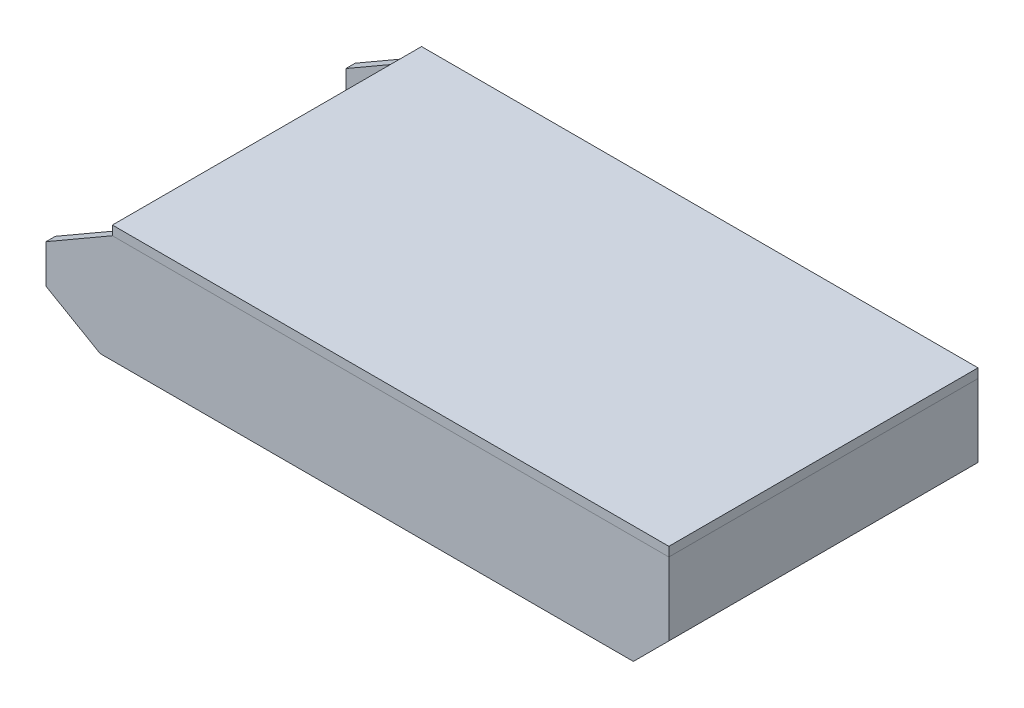
ISO-10303-21;
HEADER;
FILE_DESCRIPTION(('STEP AP214'),'2;1');
FILE_NAME('part.step','',(''),(''),'','','');
FILE_SCHEMA(('AUTOMOTIVE_DESIGN { 1 0 10303 214 1 1 1 1 }'));
ENDSEC;
DATA;
#1=APPLICATION_CONTEXT('core data for automotive mechanical design processes');
#2=APPLICATION_PROTOCOL_DEFINITION('international standard','automotive_design',2000,#1);
#3=PRODUCT_CONTEXT('',#1,'mechanical');
#4=PRODUCT('Part','Part','',(#3));
#5=PRODUCT_RELATED_PRODUCT_CATEGORY('part','',(#4));
#6=PRODUCT_DEFINITION_FORMATION('','',#4);
#7=PRODUCT_DEFINITION_CONTEXT('part definition',#1,'design');
#8=PRODUCT_DEFINITION('design','',#6,#7);
#9=PRODUCT_DEFINITION_SHAPE('','',#8);
#10=(LENGTH_UNIT() NAMED_UNIT(*) SI_UNIT(.MILLI.,.METRE.));
#11=(NAMED_UNIT(*) PLANE_ANGLE_UNIT() SI_UNIT($,.RADIAN.));
#12=(NAMED_UNIT(*) SI_UNIT($,.STERADIAN.) SOLID_ANGLE_UNIT());
#13=UNCERTAINTY_MEASURE_WITH_UNIT(LENGTH_MEASURE(1.E-05),#10,'distance_accuracy_value','');
#14=(GEOMETRIC_REPRESENTATION_CONTEXT(3) GLOBAL_UNCERTAINTY_ASSIGNED_CONTEXT((#13)) GLOBAL_UNIT_ASSIGNED_CONTEXT((#10,
#11,#12)) REPRESENTATION_CONTEXT('',''));
#15=CARTESIAN_POINT('',(0.,0.,0.));
#16=DIRECTION('',(0.,0.,1.));
#17=DIRECTION('',(1.,0.,0.));
#18=AXIS2_PLACEMENT_3D('',#15,#16,#17);
#19=CARTESIAN_POINT('',(-180.,75.9999999999932,100.));
#20=DIRECTION('',(1.,0.,0.));
#21=DIRECTION('',(0.,0.,-1.));
#22=AXIS2_PLACEMENT_3D('',#19,#20,#21);
#23=PLANE('',#22);
#24=DIRECTION('',(0.,0.,1.));
#25=VECTOR('',#24,1.);
#26=CARTESIAN_POINT('',(-180.,69.9999999999932,100.));
#27=LINE('',#26,#25);
#28=CARTESIAN_POINT('',(-180.,69.9999999999932,-100.));
#29=VERTEX_POINT('',#28);
#30=CARTESIAN_POINT('',(-180.,69.9999999999932,100.));
#31=VERTEX_POINT('',#30);
#32=EDGE_CURVE('E120',#29,#31,#27,.T.);
#33=ORIENTED_EDGE('',*,*,#32,.T.);
#34=DIRECTION('',(0.,-1.,0.));
#35=VECTOR('',#34,1.);
#36=CARTESIAN_POINT('',(-180.,75.9999999999932,100.));
#37=LINE('',#36,#35);
#38=CARTESIAN_POINT('',(-180.,75.9999999999932,100.));
#39=VERTEX_POINT('',#38);
#40=EDGE_CURVE('E12',#39,#31,#37,.T.);
#41=ORIENTED_EDGE('',*,*,#40,.F.);
#42=DIRECTION('',(0.,0.,1.));
#43=VECTOR('',#42,1.);
#44=CARTESIAN_POINT('',(-180.,75.9999999999932,100.));
#45=LINE('',#44,#43);
#46=CARTESIAN_POINT('',(-180.,75.9999999999932,-100.));
#47=VERTEX_POINT('',#46);
#48=EDGE_CURVE('E108',#47,#39,#45,.T.);
#49=ORIENTED_EDGE('',*,*,#48,.F.);
#50=DIRECTION('',(0.,-1.,0.));
#51=VECTOR('',#50,1.);
#52=CARTESIAN_POINT('',(-180.,75.9999999999932,-100.));
#53=LINE('',#52,#51);
#54=EDGE_CURVE('E116',#47,#29,#53,.T.);
#55=ORIENTED_EDGE('',*,*,#54,.T.);
#56=EDGE_LOOP('',(#33,#41,#49,#55));
#57=FACE_BOUND('',#56,.T.);
#58=ADVANCED_FACE('F57',(#57),#23,.F.);
#59=CARTESIAN_POINT('',(180.,75.9999999999932,100.));
#60=DIRECTION('',(0.,0.,-1.));
#61=DIRECTION('',(-1.,0.,0.));
#62=AXIS2_PLACEMENT_3D('',#59,#60,#61);
#63=PLANE('',#62);
#64=DIRECTION('',(1.,0.,0.));
#65=VECTOR('',#64,1.);
#66=CARTESIAN_POINT('',(180.,69.9999999999932,100.));
#67=LINE('',#66,#65);
#68=CARTESIAN_POINT('',(180.,69.9999999999932,100.));
#69=VERTEX_POINT('',#68);
#70=EDGE_CURVE('E112',#31,#69,#67,.T.);
#71=ORIENTED_EDGE('',*,*,#70,.T.);
#72=DIRECTION('',(0.,-1.,0.));
#73=VECTOR('',#72,1.);
#74=CARTESIAN_POINT('',(180.,75.9999999999932,100.));
#75=LINE('',#74,#73);
#76=CARTESIAN_POINT('',(180.,75.9999999999932,100.));
#77=VERTEX_POINT('',#76);
#78=EDGE_CURVE('E65',#77,#69,#75,.T.);
#79=ORIENTED_EDGE('',*,*,#78,.F.);
#80=DIRECTION('',(1.,0.,0.));
#81=VECTOR('',#80,1.);
#82=CARTESIAN_POINT('',(180.,75.9999999999932,100.));
#83=LINE('',#82,#81);
#84=EDGE_CURVE('E103',#39,#77,#83,.T.);
#85=ORIENTED_EDGE('',*,*,#84,.F.);
#86=ORIENTED_EDGE('',*,*,#40,.T.);
#87=EDGE_LOOP('',(#71,#79,#85,#86));
#88=FACE_BOUND('',#87,.T.);
#89=ADVANCED_FACE('F111',(#88),#63,.F.);
#90=CARTESIAN_POINT('',(180.,75.9999999999932,-100.));
#91=DIRECTION('',(-1.,0.,0.));
#92=DIRECTION('',(0.,0.,1.));
#93=AXIS2_PLACEMENT_3D('',#90,#91,#92);
#94=PLANE('',#93);
#95=DIRECTION('',(0.,0.,-1.));
#96=VECTOR('',#95,1.);
#97=CARTESIAN_POINT('',(180.,69.9999999999932,-100.));
#98=LINE('',#97,#96);
#99=CARTESIAN_POINT('',(180.,69.9999999999932,-100.));
#100=VERTEX_POINT('',#99);
#101=EDGE_CURVE('E90',#69,#100,#98,.T.);
#102=ORIENTED_EDGE('',*,*,#101,.T.);
#103=DIRECTION('',(0.,-1.,0.));
#104=VECTOR('',#103,1.);
#105=CARTESIAN_POINT('',(180.,75.9999999999932,-100.));
#106=LINE('',#105,#104);
#107=CARTESIAN_POINT('',(180.,75.9999999999932,-100.));
#108=VERTEX_POINT('',#107);
#109=EDGE_CURVE('E113',#108,#100,#106,.T.);
#110=ORIENTED_EDGE('',*,*,#109,.F.);
#111=DIRECTION('',(0.,0.,-1.));
#112=VECTOR('',#111,1.);
#113=CARTESIAN_POINT('',(180.,75.9999999999932,-100.));
#114=LINE('',#113,#112);
#115=EDGE_CURVE('E106',#77,#108,#114,.T.);
#116=ORIENTED_EDGE('',*,*,#115,.F.);
#117=ORIENTED_EDGE('',*,*,#78,.T.);
#118=EDGE_LOOP('',(#102,#110,#116,#117));
#119=FACE_BOUND('',#118,.T.);
#120=ADVANCED_FACE('F114',(#119),#94,.F.);
#121=CARTESIAN_POINT('',(-180.,75.9999999999932,-100.));
#122=DIRECTION('',(0.,0.,1.));
#123=DIRECTION('',(1.,0.,0.));
#124=AXIS2_PLACEMENT_3D('',#121,#122,#123);
#125=PLANE('',#124);
#126=DIRECTION('',(-1.,0.,0.));
#127=VECTOR('',#126,1.);
#128=CARTESIAN_POINT('',(-180.,69.9999999999932,-100.));
#129=LINE('',#128,#127);
#130=EDGE_CURVE('E96',#100,#29,#129,.T.);
#131=ORIENTED_EDGE('',*,*,#130,.T.);
#132=ORIENTED_EDGE('',*,*,#54,.F.);
#133=DIRECTION('',(-1.,0.,0.));
#134=VECTOR('',#133,1.);
#135=CARTESIAN_POINT('',(-180.,75.9999999999932,-100.));
#136=LINE('',#135,#134);
#137=EDGE_CURVE('E73',#108,#47,#136,.T.);
#138=ORIENTED_EDGE('',*,*,#137,.F.);
#139=ORIENTED_EDGE('',*,*,#109,.T.);
#140=EDGE_LOOP('',(#131,#132,#138,#139));
#141=FACE_BOUND('',#140,.T.);
#142=ADVANCED_FACE('F127',(#141),#125,.F.);
#143=CARTESIAN_POINT('',(0.,75.9999999999932,0.));
#144=DIRECTION('',(0.,-1.,0.));
#145=DIRECTION('',(0.,0.,-1.));
#146=AXIS2_PLACEMENT_3D('',#143,#144,#145);
#147=PLANE('',#146);
#148=ORIENTED_EDGE('',*,*,#48,.T.);
#149=ORIENTED_EDGE('',*,*,#84,.T.);
#150=ORIENTED_EDGE('',*,*,#115,.T.);
#151=ORIENTED_EDGE('',*,*,#137,.T.);
#152=EDGE_LOOP('',(#148,#149,#150,#151));
#153=FACE_BOUND('',#152,.T.);
#154=ADVANCED_FACE('F104',(#153),#147,.F.);
#155=CARTESIAN_POINT('',(0.,69.9999999999932,0.));
#156=DIRECTION('',(0.,-1.,0.));
#157=DIRECTION('',(0.,0.,-1.));
#158=AXIS2_PLACEMENT_3D('',#155,#156,#157);
#159=PLANE('',#158);
#160=ORIENTED_EDGE('',*,*,#32,.F.);
#161=ORIENTED_EDGE('',*,*,#130,.F.);
#162=ORIENTED_EDGE('',*,*,#101,.F.);
#163=ORIENTED_EDGE('',*,*,#70,.F.);
#164=EDGE_LOOP('',(#160,#161,#162,#163));
#165=FACE_BOUND('',#164,.T.);
#166=ADVANCED_FACE('F130',(#165),#159,.T.);
#167=CLOSED_SHELL('',(#58,#89,#120,#142,#154,#166));
#168=MANIFOLD_SOLID_BREP('B2_NOT_SHOWN',#167);
#169=CARTESIAN_POINT('',(180.,69.9999999999932,141.423476786197));
#170=DIRECTION('',(-1.,0.,0.));
#171=DIRECTION('',(0.,0.,1.));
#172=AXIS2_PLACEMENT_3D('',#169,#170,#171);
#173=PLANE('',#172);
#174=DIRECTION('',(0.,0.,-1.));
#175=VECTOR('',#174,1.);
#176=CARTESIAN_POINT('',(180.,69.9999999999932,141.423476786197));
#177=LINE('',#176,#175);
#178=CARTESIAN_POINT('',(180.,69.9999999999932,100.));
#179=VERTEX_POINT('',#178);
#180=CARTESIAN_POINT('',(180.,69.9999999999932,-100.));
#181=VERTEX_POINT('',#180);
#182=EDGE_CURVE('E506',#179,#181,#177,.T.);
#183=ORIENTED_EDGE('',*,*,#182,.F.);
#184=DIRECTION('',(0.,1.,0.));
#185=VECTOR('',#184,1.);
#186=CARTESIAN_POINT('',(180.,69.9999999999932,100.));
#187=LINE('',#186,#185);
#188=CARTESIAN_POINT('',(180.,22.9576132568553,100.));
#189=VERTEX_POINT('',#188);
#190=EDGE_CURVE('E377',#189,#179,#187,.T.);
#191=ORIENTED_EDGE('',*,*,#190,.F.);
#192=DIRECTION('',(0.,0.,-1.));
#193=VECTOR('',#192,1.);
#194=CARTESIAN_POINT('',(180.,22.9576132568553,141.423476786197));
#195=LINE('',#194,#193);
#196=CARTESIAN_POINT('',(180.,22.9576132568553,-100.));
#197=VERTEX_POINT('',#196);
#198=EDGE_CURVE('E184',#189,#197,#195,.T.);
#199=ORIENTED_EDGE('',*,*,#198,.T.);
#200=DIRECTION('',(0.,-1.,0.));
#201=VECTOR('',#200,1.);
#202=CARTESIAN_POINT('',(180.,22.9576132568553,-100.));
#203=LINE('',#202,#201);
#204=EDGE_CURVE('E418',#181,#197,#203,.T.);
#205=ORIENTED_EDGE('',*,*,#204,.F.);
#206=EDGE_LOOP('',(#183,#191,#199,#205));
#207=FACE_BOUND('',#206,.T.);
#208=ADVANCED_FACE('F181',(#207),#173,.F.);
#209=CARTESIAN_POINT('',(180.,69.9999999999932,141.423476786197));
#210=DIRECTION('',(0.,-1.,0.));
#211=DIRECTION('',(0.,0.,-1.));
#212=AXIS2_PLACEMENT_3D('',#209,#210,#211);
#213=PLANE('',#212);
#214=DIRECTION('',(1.,0.,0.));
#215=VECTOR('',#214,1.);
#216=CARTESIAN_POINT('',(180.,69.9999999999932,-94.));
#217=LINE('',#216,#215);
#218=CARTESIAN_POINT('',(-171.514718625755,69.9999999999932,-94.));
#219=VERTEX_POINT('',#218);
#220=CARTESIAN_POINT('',(174.,69.9999999999932,-94.));
#221=VERTEX_POINT('',#220);
#222=EDGE_CURVE('E440',#219,#221,#217,.T.);
#223=ORIENTED_EDGE('',*,*,#222,.T.);
#224=DIRECTION('',(0.,0.,-1.));
#225=VECTOR('',#224,1.);
#226=CARTESIAN_POINT('',(174.,69.9999999999932,141.423476786197));
#227=LINE('',#226,#225);
#228=CARTESIAN_POINT('',(174.,69.9999999999932,94.));
#229=VERTEX_POINT('',#228);
#230=EDGE_CURVE('E504',#229,#221,#227,.T.);
#231=ORIENTED_EDGE('',*,*,#230,.F.);
#232=DIRECTION('',(-1.,0.,0.));
#233=VECTOR('',#232,1.);
#234=CARTESIAN_POINT('',(-180.,69.9999999999932,94.));
#235=LINE('',#234,#233);
#236=CARTESIAN_POINT('',(-171.514718625755,69.9999999999932,94.));
#237=VERTEX_POINT('',#236);
#238=EDGE_CURVE('E353',#229,#237,#235,.T.);
#239=ORIENTED_EDGE('',*,*,#238,.T.);
#240=DIRECTION('',(0.,0.,-1.));
#241=VECTOR('',#240,1.);
#242=CARTESIAN_POINT('',(-171.514718625755,69.9999999999932,192.994949366112));
#243=LINE('',#242,#241);
#244=EDGE_CURVE('E319',#237,#219,#243,.T.);
#245=ORIENTED_EDGE('',*,*,#244,.T.);
#246=EDGE_LOOP('',(#223,#231,#239,#245));
#247=FACE_BOUND('',#246,.T.);
#248=ORIENTED_EDGE('',*,*,#182,.T.);
#249=DIRECTION('',(1.,0.,0.));
#250=VECTOR('',#249,1.);
#251=CARTESIAN_POINT('',(180.,69.9999999999932,-100.));
#252=LINE('',#251,#250);
#253=CARTESIAN_POINT('',(-180.,69.9999999999932,-100.));
#254=VERTEX_POINT('',#253);
#255=EDGE_CURVE('E428',#254,#181,#252,.T.);
#256=ORIENTED_EDGE('',*,*,#255,.F.);
#257=DIRECTION('',(0.,0.,-1.));
#258=VECTOR('',#257,1.);
#259=CARTESIAN_POINT('',(-180.,69.9999999999932,-94.));
#260=LINE('',#259,#258);
#261=CARTESIAN_POINT('',(-180.,69.9999999999932,-94.));
#262=VERTEX_POINT('',#261);
#263=EDGE_CURVE('E471',#262,#254,#260,.T.);
#264=ORIENTED_EDGE('',*,*,#263,.F.);
#265=DIRECTION('',(0.,0.,-1.));
#266=VECTOR('',#265,1.);
#267=CARTESIAN_POINT('',(-180.,69.9999999999932,192.994949366112));
#268=LINE('',#267,#266);
#269=CARTESIAN_POINT('',(-180.,69.9999999999932,94.));
#270=VERTEX_POINT('',#269);
#271=EDGE_CURVE('E350',#270,#262,#268,.T.);
#272=ORIENTED_EDGE('',*,*,#271,.F.);
#273=DIRECTION('',(0.,0.,1.));
#274=VECTOR('',#273,1.);
#275=CARTESIAN_POINT('',(-180.,69.9999999999932,94.));
#276=LINE('',#275,#274);
#277=CARTESIAN_POINT('',(-180.,69.9999999999932,100.));
#278=VERTEX_POINT('',#277);
#279=EDGE_CURVE('E373',#270,#278,#276,.T.);
#280=ORIENTED_EDGE('',*,*,#279,.T.);
#281=DIRECTION('',(-1.,0.,0.));
#282=VECTOR('',#281,1.);
#283=CARTESIAN_POINT('',(-180.,69.9999999999932,100.));
#284=LINE('',#283,#282);
#285=EDGE_CURVE('E381',#179,#278,#284,.T.);
#286=ORIENTED_EDGE('',*,*,#285,.F.);
#287=EDGE_LOOP('',(#248,#256,#264,#272,#280,#286));
#288=FACE_BOUND('',#287,.T.);
#289=ADVANCED_FACE('F525',(#247,#288),#213,.F.);
#290=CARTESIAN_POINT('',(174.,22.9576132568553,141.423476786197));
#291=DIRECTION('',(1.,0.,0.));
#292=DIRECTION('',(0.,0.,-1.));
#293=AXIS2_PLACEMENT_3D('',#290,#291,#292);
#294=PLANE('',#293);
#295=DIRECTION('',(0.,-1.,0.));
#296=VECTOR('',#295,1.);
#297=CARTESIAN_POINT('',(174.,22.9576132568553,94.));
#298=LINE('',#297,#296);
#299=CARTESIAN_POINT('',(174.,22.9576132568553,94.));
#300=VERTEX_POINT('',#299);
#301=EDGE_CURVE('E55',#229,#300,#298,.T.);
#302=ORIENTED_EDGE('',*,*,#301,.F.);
#303=ORIENTED_EDGE('',*,*,#230,.T.);
#304=DIRECTION('',(0.,-1.,0.));
#305=VECTOR('',#304,1.);
#306=CARTESIAN_POINT('',(174.,22.9576132568553,-94.));
#307=LINE('',#306,#305);
#308=CARTESIAN_POINT('',(174.,22.9576132568553,-94.));
#309=VERTEX_POINT('',#308);
#310=EDGE_CURVE('E502',#221,#309,#307,.T.);
#311=ORIENTED_EDGE('',*,*,#310,.T.);
#312=DIRECTION('',(0.,0.,-1.));
#313=VECTOR('',#312,1.);
#314=CARTESIAN_POINT('',(174.,22.9576132568553,141.423476786197));
#315=LINE('',#314,#313);
#316=EDGE_CURVE('E190',#300,#309,#315,.T.);
#317=ORIENTED_EDGE('',*,*,#316,.F.);
#318=EDGE_LOOP('',(#302,#303,#311,#317));
#319=FACE_BOUND('',#318,.T.);
#320=ADVANCED_FACE('F520',(#319),#294,.F.);
#321=CARTESIAN_POINT('',(171.514718625761,22.9576132568553,124.576159578633));
#322=DIRECTION('',(0.,-1.,0.));
#323=DIRECTION('',(0.,0.,-1.));
#324=AXIS2_PLACEMENT_3D('',#321,#322,#323);
#325=PLANE('',#324);
#326=DIRECTION('',(-1.,0.,0.));
#327=VECTOR('',#326,1.);
#328=CARTESIAN_POINT('',(171.514718625761,22.9576132568553,94.));
#329=LINE('',#328,#327);
#330=CARTESIAN_POINT('',(171.514718625761,22.9576132568553,94.));
#331=VERTEX_POINT('',#330);
#332=EDGE_CURVE('E494',#300,#331,#329,.T.);
#333=ORIENTED_EDGE('',*,*,#332,.F.);
#334=ORIENTED_EDGE('',*,*,#316,.T.);
#335=DIRECTION('',(-1.,0.,0.));
#336=VECTOR('',#335,1.);
#337=CARTESIAN_POINT('',(171.514718625761,22.9576132568553,-94.));
#338=LINE('',#337,#336);
#339=CARTESIAN_POINT('',(171.514718625761,22.9576132568553,-94.));
#340=VERTEX_POINT('',#339);
#341=EDGE_CURVE('E198',#309,#340,#338,.T.);
#342=ORIENTED_EDGE('',*,*,#341,.T.);
#343=DIRECTION('',(0.,0.,-1.));
#344=VECTOR('',#343,1.);
#345=CARTESIAN_POINT('',(171.514718625761,22.9576132568553,124.576159578633));
#346=LINE('',#345,#344);
#347=EDGE_CURVE('E488',#331,#340,#346,.T.);
#348=ORIENTED_EDGE('',*,*,#347,.F.);
#349=EDGE_LOOP('',(#333,#334,#342,#348));
#350=FACE_BOUND('',#349,.T.);
#351=ADVANCED_FACE('F516',(#350),#325,.F.);
#352=CARTESIAN_POINT('',(154.557105368906,6.,124.576159578633));
#353=DIRECTION('',(0.707106781186547,-0.707106781186548,0.));
#354=DIRECTION('',(0.707106781186548,0.707106781186547,0.));
#355=AXIS2_PLACEMENT_3D('',#352,#353,#354);
#356=PLANE('',#355);
#357=DIRECTION('',(-0.707106781186548,-0.707106781186547,0.));
#358=VECTOR('',#357,1.);
#359=CARTESIAN_POINT('',(154.557105368906,6.,94.));
#360=LINE('',#359,#358);
#361=CARTESIAN_POINT('',(154.557105368906,6.,94.));
#362=VERTEX_POINT('',#361);
#363=EDGE_CURVE('E491',#331,#362,#360,.T.);
#364=ORIENTED_EDGE('',*,*,#363,.F.);
#365=ORIENTED_EDGE('',*,*,#347,.T.);
#366=DIRECTION('',(-0.707106781186548,-0.707106781186547,0.));
#367=VECTOR('',#366,1.);
#368=CARTESIAN_POINT('',(154.557105368906,6.,-94.));
#369=LINE('',#368,#367);
#370=CARTESIAN_POINT('',(154.557105368906,6.,-94.));
#371=VERTEX_POINT('',#370);
#372=EDGE_CURVE('E203',#340,#371,#369,.T.);
#373=ORIENTED_EDGE('',*,*,#372,.T.);
#374=DIRECTION('',(0.,0.,-1.));
#375=VECTOR('',#374,1.);
#376=CARTESIAN_POINT('',(154.557105368906,6.,124.576159578633));
#377=LINE('',#376,#375);
#378=EDGE_CURVE('E487',#362,#371,#377,.T.);
#379=ORIENTED_EDGE('',*,*,#378,.F.);
#380=EDGE_LOOP('',(#364,#365,#373,#379));
#381=FACE_BOUND('',#380,.T.);
#382=ADVANCED_FACE('F605',(#381),#356,.F.);
#383=CARTESIAN_POINT('',(180.,22.9576132568553,124.576159578633));
#384=DIRECTION('',(-0.707106781186549,0.707106781186546,0.));
#385=DIRECTION('',(-0.707106781186546,-0.707106781186549,0.));
#386=AXIS2_PLACEMENT_3D('',#383,#384,#385);
#387=PLANE('',#386);
#388=DIRECTION('',(-0.707106781186546,-0.707106781186549,0.));
#389=VECTOR('',#388,1.);
#390=CARTESIAN_POINT('',(157.042386743145,0.,-100.));
#391=LINE('',#390,#389);
#392=CARTESIAN_POINT('',(157.042386743145,0.,-100.));
#393=VERTEX_POINT('',#392);
#394=EDGE_CURVE('E448',#197,#393,#391,.T.);
#395=ORIENTED_EDGE('',*,*,#394,.F.);
#396=ORIENTED_EDGE('',*,*,#198,.F.);
#397=DIRECTION('',(0.707106781186546,0.707106781186549,0.));
#398=VECTOR('',#397,1.);
#399=CARTESIAN_POINT('',(180.,22.9576132568553,100.));
#400=LINE('',#399,#398);
#401=CARTESIAN_POINT('',(157.042386743145,0.,100.));
#402=VERTEX_POINT('',#401);
#403=EDGE_CURVE('E323',#402,#189,#400,.T.);
#404=ORIENTED_EDGE('',*,*,#403,.F.);
#405=DIRECTION('',(0.,0.,-1.));
#406=VECTOR('',#405,1.);
#407=CARTESIAN_POINT('',(157.042386743145,0.,-94.));
#408=LINE('',#407,#406);
#409=EDGE_CURVE('E444',#402,#393,#408,.T.);
#410=ORIENTED_EDGE('',*,*,#409,.T.);
#411=EDGE_LOOP('',(#395,#396,#404,#410));
#412=FACE_BOUND('',#411,.T.);
#413=ADVANCED_FACE('F580',(#412),#387,.F.);
#414=CARTESIAN_POINT('',(0.,0.,-94.));
#415=DIRECTION('',(0.,0.,1.));
#416=DIRECTION('',(1.,0.,0.));
#417=AXIS2_PLACEMENT_3D('',#414,#415,#416);
#418=PLANE('',#417);
#419=ORIENTED_EDGE('',*,*,#310,.F.);
#420=ORIENTED_EDGE('',*,*,#222,.F.);
#421=DIRECTION('',(-0.707106781186548,0.707106781186547,0.));
#422=VECTOR('',#421,1.);
#423=CARTESIAN_POINT('',(-110.000000000003,8.4852813742416,-94.));
#424=LINE('',#423,#422);
#425=CARTESIAN_POINT('',(-110.000000000003,8.4852813742416,-94.));
#426=VERTEX_POINT('',#425);
#427=EDGE_CURVE('E334',#426,#219,#424,.T.);
#428=ORIENTED_EDGE('',*,*,#427,.F.);
#429=DIRECTION('',(0.,1.,0.));
#430=VECTOR('',#429,1.);
#431=CARTESIAN_POINT('',(-110.000000000003,-3.41004455870382E-12,-94.));
#432=LINE('',#431,#430);
#433=CARTESIAN_POINT('',(-110.000000000003,6.,-94.));
#434=VERTEX_POINT('',#433);
#435=EDGE_CURVE('E332',#434,#426,#432,.T.);
#436=ORIENTED_EDGE('',*,*,#435,.F.);
#437=DIRECTION('',(-1.,0.,0.));
#438=VECTOR('',#437,1.);
#439=CARTESIAN_POINT('',(-110.000000000003,6.,-94.));
#440=LINE('',#439,#438);
#441=EDGE_CURVE('E412',#371,#434,#440,.T.);
#442=ORIENTED_EDGE('',*,*,#441,.F.);
#443=ORIENTED_EDGE('',*,*,#372,.F.);
#444=ORIENTED_EDGE('',*,*,#341,.F.);
#445=EDGE_LOOP('',(#419,#420,#428,#436,#442,#443,#444));
#446=FACE_BOUND('',#445,.T.);
#447=ADVANCED_FACE('F523',(#446),#418,.T.);
#448=CARTESIAN_POINT('',(0.,0.,94.));
#449=DIRECTION('',(0.,0.,1.));
#450=DIRECTION('',(1.,0.,0.));
#451=AXIS2_PLACEMENT_3D('',#448,#449,#450);
#452=PLANE('',#451);
#453=ORIENTED_EDGE('',*,*,#238,.F.);
#454=ORIENTED_EDGE('',*,*,#301,.T.);
#455=ORIENTED_EDGE('',*,*,#332,.T.);
#456=ORIENTED_EDGE('',*,*,#363,.T.);
#457=DIRECTION('',(-1.,0.,0.));
#458=VECTOR('',#457,1.);
#459=CARTESIAN_POINT('',(-110.000000000003,6.,94.));
#460=LINE('',#459,#458);
#461=CARTESIAN_POINT('',(-110.000000000003,6.,94.));
#462=VERTEX_POINT('',#461);
#463=EDGE_CURVE('E338',#362,#462,#460,.T.);
#464=ORIENTED_EDGE('',*,*,#463,.T.);
#465=DIRECTION('',(0.,1.,0.));
#466=VECTOR('',#465,1.);
#467=CARTESIAN_POINT('',(-110.000000000003,-3.41004455870382E-12,94.));
#468=LINE('',#467,#466);
#469=CARTESIAN_POINT('',(-110.000000000003,8.4852813742416,94.));
#470=VERTEX_POINT('',#469);
#471=EDGE_CURVE('E324',#462,#470,#468,.T.);
#472=ORIENTED_EDGE('',*,*,#471,.T.);
#473=DIRECTION('',(-0.707106781186548,0.707106781186547,0.));
#474=VECTOR('',#473,1.);
#475=CARTESIAN_POINT('',(-110.000000000003,8.4852813742416,94.));
#476=LINE('',#475,#474);
#477=EDGE_CURVE('E313',#470,#237,#476,.T.);
#478=ORIENTED_EDGE('',*,*,#477,.T.);
#479=EDGE_LOOP('',(#453,#454,#455,#456,#464,#472,#478));
#480=FACE_BOUND('',#479,.T.);
#481=ADVANCED_FACE('F336',(#480),#452,.F.);
#482=CARTESIAN_POINT('',(-110.000000000003,6.,367.108302617103));
#483=DIRECTION('',(0.,-1.,0.));
#484=DIRECTION('',(1.,0.,0.));
#485=AXIS2_PLACEMENT_3D('',#482,#483,#484);
#486=PLANE('',#485);
#487=ORIENTED_EDGE('',*,*,#463,.F.);
#488=ORIENTED_EDGE('',*,*,#378,.T.);
#489=ORIENTED_EDGE('',*,*,#441,.T.);
#490=DIRECTION('',(0.,0.,-1.));
#491=VECTOR('',#490,1.);
#492=CARTESIAN_POINT('',(-110.000000000003,6.,367.108302617103));
#493=LINE('',#492,#491);
#494=EDGE_CURVE('E403',#462,#434,#493,.T.);
#495=ORIENTED_EDGE('',*,*,#494,.F.);
#496=EDGE_LOOP('',(#487,#488,#489,#495));
#497=FACE_BOUND('',#496,.T.);
#498=ADVANCED_FACE('F623',(#497),#486,.F.);
#499=DIRECTION('',(-1.,0.,0.));
#500=VECTOR('',#499,1.);
#501=CARTESIAN_POINT('',(-187.957613256855,0.,-94.));
#502=LINE('',#501,#500);
#503=CARTESIAN_POINT('',(-110.000000000003,-3.41004455870382E-12,-94.));
#504=VERTEX_POINT('',#503);
#505=CARTESIAN_POINT('',(-187.957613256855,0.,-94.));
#506=VERTEX_POINT('',#505);
#507=EDGE_CURVE('E424',#504,#506,#502,.T.);
#508=ORIENTED_EDGE('',*,*,#507,.F.);
#509=DIRECTION('',(0.707106781186547,-0.707106781186547,0.));
#510=VECTOR('',#509,1.);
#511=CARTESIAN_POINT('',(-180.,69.9999999999932,-94.));
#512=LINE('',#511,#510);
#513=EDGE_CURVE('E344',#262,#504,#512,.T.);
#514=ORIENTED_EDGE('',*,*,#513,.F.);
#515=DIRECTION('',(0.866025403784441,0.499999999999995,0.));
#516=VECTOR('',#515,1.);
#517=CARTESIAN_POINT('',(-180.,69.9999999999932,-94.));
#518=LINE('',#517,#516);
#519=CARTESIAN_POINT('',(-222.957613256855,45.1984104224043,-94.));
#520=VERTEX_POINT('',#519);
#521=EDGE_CURVE('E436',#520,#262,#518,.T.);
#522=ORIENTED_EDGE('',*,*,#521,.F.);
#523=DIRECTION('',(0.,1.,0.));
#524=VECTOR('',#523,1.);
#525=CARTESIAN_POINT('',(-222.957613256855,45.1984104224043,-94.));
#526=LINE('',#525,#524);
#527=CARTESIAN_POINT('',(-222.957613256855,20.2072594216366,-94.));
#528=VERTEX_POINT('',#527);
#529=EDGE_CURVE('E432',#528,#520,#526,.T.);
#530=ORIENTED_EDGE('',*,*,#529,.F.);
#531=DIRECTION('',(-0.866025403784442,0.499999999999995,0.));
#532=VECTOR('',#531,1.);
#533=CARTESIAN_POINT('',(-222.957613256855,20.2072594216366,-94.));
#534=LINE('',#533,#532);
#535=EDGE_CURVE('E427',#506,#528,#534,.T.);
#536=ORIENTED_EDGE('',*,*,#535,.F.);
#537=EDGE_LOOP('',(#508,#514,#522,#530,#536));
#538=FACE_BOUND('',#537,.T.);
#539=ADVANCED_FACE('F541',(#538),#418,.T.);
#540=DIRECTION('',(0.707106781186548,-0.707106781186548,0.));
#541=VECTOR('',#540,1.);
#542=CARTESIAN_POINT('',(-180.,69.9999999999932,94.));
#543=LINE('',#542,#541);
#544=CARTESIAN_POINT('',(-110.000000000003,-3.41393580072236E-12,94.));
#545=VERTEX_POINT('',#544);
#546=EDGE_CURVE('E340',#270,#545,#543,.T.);
#547=ORIENTED_EDGE('',*,*,#546,.T.);
#548=DIRECTION('',(1.,0.,0.));
#549=VECTOR('',#548,1.);
#550=CARTESIAN_POINT('',(157.042386743145,0.,94.));
#551=LINE('',#550,#549);
#552=CARTESIAN_POINT('',(-187.957613256855,0.,94.));
#553=VERTEX_POINT('',#552);
#554=EDGE_CURVE('E369',#553,#545,#551,.T.);
#555=ORIENTED_EDGE('',*,*,#554,.F.);
#556=DIRECTION('',(0.866025403784442,-0.499999999999995,0.));
#557=VECTOR('',#556,1.);
#558=CARTESIAN_POINT('',(-222.957613256855,20.2072594216366,94.));
#559=LINE('',#558,#557);
#560=CARTESIAN_POINT('',(-222.957613256855,20.2072594216366,94.));
#561=VERTEX_POINT('',#560);
#562=EDGE_CURVE('E365',#561,#553,#559,.T.);
#563=ORIENTED_EDGE('',*,*,#562,.F.);
#564=DIRECTION('',(0.,-1.,0.));
#565=VECTOR('',#564,1.);
#566=CARTESIAN_POINT('',(-222.957613256855,45.1984104224043,94.));
#567=LINE('',#566,#565);
#568=CARTESIAN_POINT('',(-222.957613256855,45.1984104224043,94.));
#569=VERTEX_POINT('',#568);
#570=EDGE_CURVE('E361',#569,#561,#567,.T.);
#571=ORIENTED_EDGE('',*,*,#570,.F.);
#572=DIRECTION('',(-0.866025403784441,-0.499999999999995,0.));
#573=VECTOR('',#572,1.);
#574=CARTESIAN_POINT('',(-180.,69.9999999999932,94.));
#575=LINE('',#574,#573);
#576=EDGE_CURVE('E356',#270,#569,#575,.T.);
#577=ORIENTED_EDGE('',*,*,#576,.F.);
#578=EDGE_LOOP('',(#547,#555,#563,#571,#577));
#579=FACE_BOUND('',#578,.T.);
#580=ADVANCED_FACE('F551',(#579),#452,.F.);
#581=CARTESIAN_POINT('',(-180.,69.9999999999932,-94.));
#582=DIRECTION('',(-0.499999999999995,0.866025403784441,0.));
#583=DIRECTION('',(-0.866025403784442,-0.499999999999995,0.));
#584=AXIS2_PLACEMENT_3D('',#581,#582,#583);
#585=PLANE('',#584);
#586=DIRECTION('',(0.866025403784441,0.499999999999995,0.));
#587=VECTOR('',#586,1.);
#588=CARTESIAN_POINT('',(-180.,69.9999999999932,-100.));
#589=LINE('',#588,#587);
#590=CARTESIAN_POINT('',(-222.957613256855,45.1984104224043,-100.));
#591=VERTEX_POINT('',#590);
#592=EDGE_CURVE('E464',#591,#254,#589,.T.);
#593=ORIENTED_EDGE('',*,*,#592,.F.);
#594=DIRECTION('',(0.,0.,-1.));
#595=VECTOR('',#594,1.);
#596=CARTESIAN_POINT('',(-222.957613256855,45.1984104224043,-94.));
#597=LINE('',#596,#595);
#598=EDGE_CURVE('E474',#520,#591,#597,.T.);
#599=ORIENTED_EDGE('',*,*,#598,.F.);
#600=ORIENTED_EDGE('',*,*,#521,.T.);
#601=ORIENTED_EDGE('',*,*,#263,.T.);
#602=EDGE_LOOP('',(#593,#599,#600,#601));
#603=FACE_BOUND('',#602,.T.);
#604=ADVANCED_FACE('F572',(#603),#585,.T.);
#605=CARTESIAN_POINT('',(-222.957613256855,45.1984104224043,-94.));
#606=DIRECTION('',(-1.,0.,0.));
#607=DIRECTION('',(0.,0.,1.));
#608=AXIS2_PLACEMENT_3D('',#605,#606,#607);
#609=PLANE('',#608);
#610=DIRECTION('',(0.,1.,0.));
#611=VECTOR('',#610,1.);
#612=CARTESIAN_POINT('',(-222.957613256855,45.1984104224043,-100.));
#613=LINE('',#612,#611);
#614=CARTESIAN_POINT('',(-222.957613256855,20.2072594216366,-100.));
#615=VERTEX_POINT('',#614);
#616=EDGE_CURVE('E460',#615,#591,#613,.T.);
#617=ORIENTED_EDGE('',*,*,#616,.F.);
#618=DIRECTION('',(0.,0.,-1.));
#619=VECTOR('',#618,1.);
#620=CARTESIAN_POINT('',(-222.957613256855,20.2072594216366,-94.));
#621=LINE('',#620,#619);
#622=EDGE_CURVE('E477',#528,#615,#621,.T.);
#623=ORIENTED_EDGE('',*,*,#622,.F.);
#624=ORIENTED_EDGE('',*,*,#529,.T.);
#625=ORIENTED_EDGE('',*,*,#598,.T.);
#626=EDGE_LOOP('',(#617,#623,#624,#625));
#627=FACE_BOUND('',#626,.T.);
#628=ADVANCED_FACE('F574',(#627),#609,.T.);
#629=CARTESIAN_POINT('',(-222.957613256855,20.2072594216366,-94.));
#630=DIRECTION('',(-0.499999999999995,-0.866025403784442,0.));
#631=DIRECTION('',(0.866025403784442,-0.499999999999995,0.));
#632=AXIS2_PLACEMENT_3D('',#629,#630,#631);
#633=PLANE('',#632);
#634=DIRECTION('',(-0.866025403784442,0.499999999999995,0.));
#635=VECTOR('',#634,1.);
#636=CARTESIAN_POINT('',(-222.957613256855,20.2072594216366,-100.));
#637=LINE('',#636,#635);
#638=CARTESIAN_POINT('',(-187.957613256855,0.,-100.));
#639=VERTEX_POINT('',#638);
#640=EDGE_CURVE('E456',#639,#615,#637,.T.);
#641=ORIENTED_EDGE('',*,*,#640,.F.);
#642=DIRECTION('',(0.,0.,-1.));
#643=VECTOR('',#642,1.);
#644=CARTESIAN_POINT('',(-187.957613256855,0.,-94.));
#645=LINE('',#644,#643);
#646=EDGE_CURVE('E480',#506,#639,#645,.T.);
#647=ORIENTED_EDGE('',*,*,#646,.F.);
#648=ORIENTED_EDGE('',*,*,#535,.T.);
#649=ORIENTED_EDGE('',*,*,#622,.T.);
#650=EDGE_LOOP('',(#641,#647,#648,#649));
#651=FACE_BOUND('',#650,.T.);
#652=ADVANCED_FACE('F577',(#651),#633,.T.);
#653=CARTESIAN_POINT('',(-187.957613256855,0.,-94.));
#654=DIRECTION('',(0.,-1.,0.));
#655=DIRECTION('',(1.,0.,0.));
#656=AXIS2_PLACEMENT_3D('',#653,#654,#655);
#657=PLANE('',#656);
#658=DIRECTION('',(-1.,0.,0.));
#659=VECTOR('',#658,1.);
#660=CARTESIAN_POINT('',(-187.957613256855,0.,-100.));
#661=LINE('',#660,#659);
#662=EDGE_CURVE('E452',#393,#639,#661,.T.);
#663=ORIENTED_EDGE('',*,*,#662,.F.);
#664=ORIENTED_EDGE('',*,*,#409,.F.);
#665=DIRECTION('',(1.,0.,0.));
#666=VECTOR('',#665,1.);
#667=CARTESIAN_POINT('',(157.042386743145,0.,100.));
#668=LINE('',#667,#666);
#669=CARTESIAN_POINT('',(-187.957613256855,0.,100.));
#670=VERTEX_POINT('',#669);
#671=EDGE_CURVE('E357',#670,#402,#668,.T.);
#672=ORIENTED_EDGE('',*,*,#671,.F.);
#673=DIRECTION('',(0.,0.,1.));
#674=VECTOR('',#673,1.);
#675=CARTESIAN_POINT('',(-187.957613256855,0.,94.));
#676=LINE('',#675,#674);
#677=EDGE_CURVE('E400',#553,#670,#676,.T.);
#678=ORIENTED_EDGE('',*,*,#677,.F.);
#679=ORIENTED_EDGE('',*,*,#554,.T.);
#680=DIRECTION('',(0.,0.,-1.));
#681=VECTOR('',#680,1.);
#682=CARTESIAN_POINT('',(-110.,0.,367.108302617103));
#683=LINE('',#682,#681);
#684=EDGE_CURVE('E415',#545,#504,#683,.T.);
#685=ORIENTED_EDGE('',*,*,#684,.T.);
#686=ORIENTED_EDGE('',*,*,#507,.T.);
#687=ORIENTED_EDGE('',*,*,#646,.T.);
#688=EDGE_LOOP('',(#663,#664,#672,#678,#679,#685,#686,#687));
#689=FACE_BOUND('',#688,.T.);
#690=ADVANCED_FACE('F546',(#689),#657,.T.);
#691=CARTESIAN_POINT('',(0.,0.,-100.));
#692=DIRECTION('',(0.,0.,1.));
#693=DIRECTION('',(1.,0.,0.));
#694=AXIS2_PLACEMENT_3D('',#691,#692,#693);
#695=PLANE('',#694);
#696=ORIENTED_EDGE('',*,*,#204,.T.);
#697=ORIENTED_EDGE('',*,*,#394,.T.);
#698=ORIENTED_EDGE('',*,*,#662,.T.);
#699=ORIENTED_EDGE('',*,*,#640,.T.);
#700=ORIENTED_EDGE('',*,*,#616,.T.);
#701=ORIENTED_EDGE('',*,*,#592,.T.);
#702=ORIENTED_EDGE('',*,*,#255,.T.);
#703=EDGE_LOOP('',(#696,#697,#698,#699,#700,#701,#702));
#704=FACE_BOUND('',#703,.T.);
#705=ADVANCED_FACE('F568',(#704),#695,.F.);
#706=CARTESIAN_POINT('',(-222.957613256855,20.2072594216366,94.));
#707=DIRECTION('',(-0.499999999999995,-0.866025403784442,0.));
#708=DIRECTION('',(0.866025403784442,-0.499999999999995,0.));
#709=AXIS2_PLACEMENT_3D('',#706,#707,#708);
#710=PLANE('',#709);
#711=DIRECTION('',(0.866025403784442,-0.499999999999995,0.));
#712=VECTOR('',#711,1.);
#713=CARTESIAN_POINT('',(-222.957613256855,20.2072594216366,100.));
#714=LINE('',#713,#712);
#715=CARTESIAN_POINT('',(-222.957613256855,20.2072594216366,100.));
#716=VERTEX_POINT('',#715);
#717=EDGE_CURVE('E393',#716,#670,#714,.T.);
#718=ORIENTED_EDGE('',*,*,#717,.F.);
#719=DIRECTION('',(0.,0.,1.));
#720=VECTOR('',#719,1.);
#721=CARTESIAN_POINT('',(-222.957613256855,20.2072594216366,94.));
#722=LINE('',#721,#720);
#723=EDGE_CURVE('E404',#561,#716,#722,.T.);
#724=ORIENTED_EDGE('',*,*,#723,.F.);
#725=ORIENTED_EDGE('',*,*,#562,.T.);
#726=ORIENTED_EDGE('',*,*,#677,.T.);
#727=EDGE_LOOP('',(#718,#724,#725,#726));
#728=FACE_BOUND('',#727,.T.);
#729=ADVANCED_FACE('F583',(#728),#710,.T.);
#730=CARTESIAN_POINT('',(-222.957613256855,45.1984104224043,94.));
#731=DIRECTION('',(-1.,0.,0.));
#732=DIRECTION('',(0.,0.,1.));
#733=AXIS2_PLACEMENT_3D('',#730,#731,#732);
#734=PLANE('',#733);
#735=DIRECTION('',(0.,-1.,0.));
#736=VECTOR('',#735,1.);
#737=CARTESIAN_POINT('',(-222.957613256855,45.1984104224043,100.));
#738=LINE('',#737,#736);
#739=CARTESIAN_POINT('',(-222.957613256855,45.1984104224043,100.));
#740=VERTEX_POINT('',#739);
#741=EDGE_CURVE('E389',#740,#716,#738,.T.);
#742=ORIENTED_EDGE('',*,*,#741,.F.);
#743=DIRECTION('',(0.,0.,1.));
#744=VECTOR('',#743,1.);
#745=CARTESIAN_POINT('',(-222.957613256855,45.1984104224043,94.));
#746=LINE('',#745,#744);
#747=EDGE_CURVE('E407',#569,#740,#746,.T.);
#748=ORIENTED_EDGE('',*,*,#747,.F.);
#749=ORIENTED_EDGE('',*,*,#570,.T.);
#750=ORIENTED_EDGE('',*,*,#723,.T.);
#751=EDGE_LOOP('',(#742,#748,#749,#750));
#752=FACE_BOUND('',#751,.T.);
#753=ADVANCED_FACE('F585',(#752),#734,.T.);
#754=CARTESIAN_POINT('',(-180.,69.9999999999932,94.));
#755=DIRECTION('',(-0.499999999999995,0.866025403784441,0.));
#756=DIRECTION('',(-0.866025403784442,-0.499999999999995,0.));
#757=AXIS2_PLACEMENT_3D('',#754,#755,#756);
#758=PLANE('',#757);
#759=DIRECTION('',(-0.866025403784441,-0.499999999999995,0.));
#760=VECTOR('',#759,1.);
#761=CARTESIAN_POINT('',(-180.,69.9999999999932,100.));
#762=LINE('',#761,#760);
#763=EDGE_CURVE('E385',#278,#740,#762,.T.);
#764=ORIENTED_EDGE('',*,*,#763,.F.);
#765=ORIENTED_EDGE('',*,*,#279,.F.);
#766=ORIENTED_EDGE('',*,*,#576,.T.);
#767=ORIENTED_EDGE('',*,*,#747,.T.);
#768=EDGE_LOOP('',(#764,#765,#766,#767));
#769=FACE_BOUND('',#768,.T.);
#770=ADVANCED_FACE('F559',(#769),#758,.T.);
#771=CARTESIAN_POINT('',(0.,0.,100.));
#772=DIRECTION('',(0.,0.,1.));
#773=DIRECTION('',(1.,0.,0.));
#774=AXIS2_PLACEMENT_3D('',#771,#772,#773);
#775=PLANE('',#774);
#776=ORIENTED_EDGE('',*,*,#403,.T.);
#777=ORIENTED_EDGE('',*,*,#190,.T.);
#778=ORIENTED_EDGE('',*,*,#285,.T.);
#779=ORIENTED_EDGE('',*,*,#763,.T.);
#780=ORIENTED_EDGE('',*,*,#741,.T.);
#781=ORIENTED_EDGE('',*,*,#717,.T.);
#782=ORIENTED_EDGE('',*,*,#671,.T.);
#783=EDGE_LOOP('',(#776,#777,#778,#779,#780,#781,#782));
#784=FACE_BOUND('',#783,.T.);
#785=ADVANCED_FACE('F562',(#784),#775,.T.);
#786=CARTESIAN_POINT('',(-110.000000000003,-3.41004455870382E-12,192.994949366112));
#787=DIRECTION('',(-1.,0.,0.));
#788=DIRECTION('',(0.,0.,1.));
#789=AXIS2_PLACEMENT_3D('',#786,#787,#788);
#790=PLANE('',#789);
#791=ORIENTED_EDGE('',*,*,#471,.F.);
#792=ORIENTED_EDGE('',*,*,#494,.T.);
#793=ORIENTED_EDGE('',*,*,#435,.T.);
#794=DIRECTION('',(0.,0.,-1.));
#795=VECTOR('',#794,1.);
#796=CARTESIAN_POINT('',(-110.000000000003,8.4852813742416,192.994949366112));
#797=LINE('',#796,#795);
#798=EDGE_CURVE('E317',#470,#426,#797,.T.);
#799=ORIENTED_EDGE('',*,*,#798,.F.);
#800=EDGE_LOOP('',(#791,#792,#793,#799));
#801=FACE_BOUND('',#800,.T.);
#802=ADVANCED_FACE('F328',(#801),#790,.F.);
#803=CARTESIAN_POINT('',(-110.000000000003,8.4852813742416,192.994949366112));
#804=DIRECTION('',(-0.707106781186547,-0.707106781186548,0.));
#805=DIRECTION('',(0.707106781186548,-0.707106781186547,0.));
#806=AXIS2_PLACEMENT_3D('',#803,#804,#805);
#807=PLANE('',#806);
#808=ORIENTED_EDGE('',*,*,#477,.F.);
#809=ORIENTED_EDGE('',*,*,#798,.T.);
#810=ORIENTED_EDGE('',*,*,#427,.T.);
#811=ORIENTED_EDGE('',*,*,#244,.F.);
#812=EDGE_LOOP('',(#808,#809,#810,#811));
#813=FACE_BOUND('',#812,.T.);
#814=ADVANCED_FACE('F315',(#813),#807,.F.);
#815=CARTESIAN_POINT('',(-180.,69.9999999999932,192.994949366112));
#816=DIRECTION('',(0.707106781186547,0.707106781186547,0.));
#817=DIRECTION('',(-0.707106781186548,0.707106781186548,0.));
#818=AXIS2_PLACEMENT_3D('',#815,#816,#817);
#819=PLANE('',#818);
#820=ORIENTED_EDGE('',*,*,#546,.F.);
#821=ORIENTED_EDGE('',*,*,#271,.T.);
#822=ORIENTED_EDGE('',*,*,#513,.T.);
#823=ORIENTED_EDGE('',*,*,#684,.F.);
#824=EDGE_LOOP('',(#820,#821,#822,#823));
#825=FACE_BOUND('',#824,.T.);
#826=ADVANCED_FACE('F535',(#825),#819,.F.);
#827=CLOSED_SHELL('',(#208,#289,#320,#351,#382,#413,#447,#481,#498,#539,#580,#604,#628,#652,
#690,#705,#729,#753,#770,#785,#802,#814,#826));
#828=MANIFOLD_SOLID_BREP('B6',#827);
#829=ADVANCED_BREP_SHAPE_REPRESENTATION('',(#18,#168,#828),#14);
#830=SHAPE_DEFINITION_REPRESENTATION(#9,#829);
ENDSEC;
END-ISO-10303-21;
